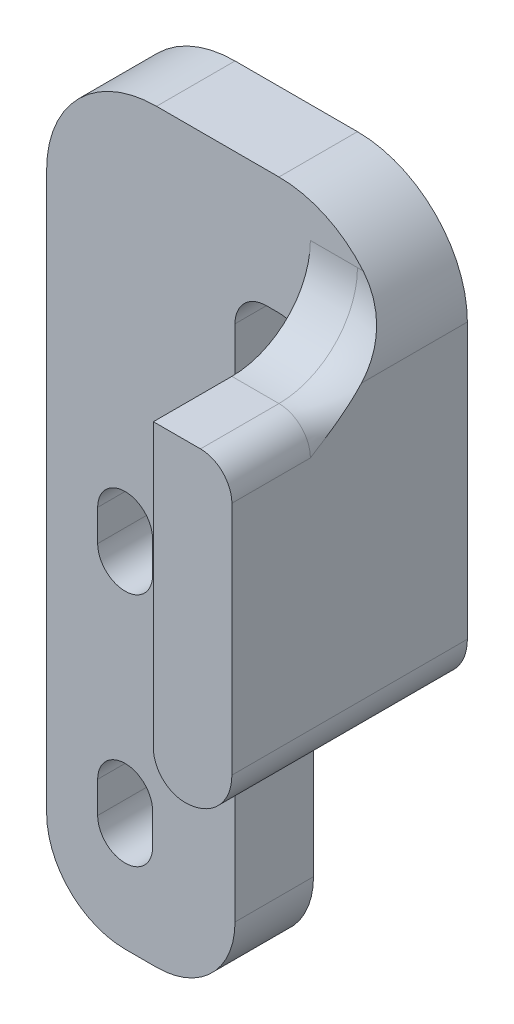
ISO-10303-21;
HEADER;
FILE_DESCRIPTION(('STEP AP214'),'2;1');
FILE_NAME('part.step','',(''),(''),'','','');
FILE_SCHEMA(('AUTOMOTIVE_DESIGN { 1 0 10303 214 1 1 1 1 }'));
ENDSEC;
DATA;
#1=APPLICATION_CONTEXT('core data for automotive mechanical design processes');
#2=APPLICATION_PROTOCOL_DEFINITION('international standard','automotive_design',2000,#1);
#3=PRODUCT_CONTEXT('',#1,'mechanical');
#4=PRODUCT('Part','Part','',(#3));
#5=PRODUCT_RELATED_PRODUCT_CATEGORY('part','',(#4));
#6=PRODUCT_DEFINITION_FORMATION('','',#4);
#7=PRODUCT_DEFINITION_CONTEXT('part definition',#1,'design');
#8=PRODUCT_DEFINITION('design','',#6,#7);
#9=PRODUCT_DEFINITION_SHAPE('','',#8);
#10=(LENGTH_UNIT() NAMED_UNIT(*) SI_UNIT(.MILLI.,.METRE.));
#11=(NAMED_UNIT(*) PLANE_ANGLE_UNIT() SI_UNIT($,.RADIAN.));
#12=(NAMED_UNIT(*) SI_UNIT($,.STERADIAN.) SOLID_ANGLE_UNIT());
#13=UNCERTAINTY_MEASURE_WITH_UNIT(LENGTH_MEASURE(1.E-05),#10,'distance_accuracy_value','');
#14=(GEOMETRIC_REPRESENTATION_CONTEXT(3) GLOBAL_UNCERTAINTY_ASSIGNED_CONTEXT((#13)) GLOBAL_UNIT_ASSIGNED_CONTEXT((#10,
#11,#12)) REPRESENTATION_CONTEXT('',''));
#15=CARTESIAN_POINT('',(0.,0.,0.));
#16=DIRECTION('',(0.,0.,1.));
#17=DIRECTION('',(1.,0.,0.));
#18=AXIS2_PLACEMENT_3D('',#15,#16,#17);
#19=CARTESIAN_POINT('',(0.,0.,5.));
#20=DIRECTION('',(0.,0.,-1.));
#21=DIRECTION('',(-1.,0.,0.));
#22=AXIS2_PLACEMENT_3D('',#19,#20,#21);
#23=PLANE('',#22);
#24=CARTESIAN_POINT('',(-2.,-13.5,5.));
#25=DIRECTION('',(0.,0.,1.));
#26=DIRECTION('',(1.,0.,0.));
#27=AXIS2_PLACEMENT_3D('',#24,#25,#26);
#28=CIRCLE('',#27,1.75);
#29=CARTESIAN_POINT('',(-3.75,-13.5,5.));
#30=VERTEX_POINT('',#29);
#31=CARTESIAN_POINT('',(-0.249999999999996,-13.5,5.));
#32=VERTEX_POINT('',#31);
#33=EDGE_CURVE('E247',#30,#32,#28,.T.);
#34=ORIENTED_EDGE('',*,*,#33,.F.);
#35=DIRECTION('',(0.,-1.,0.));
#36=VECTOR('',#35,1.);
#37=CARTESIAN_POINT('',(-3.75,-13.5,5.));
#38=LINE('',#37,#36);
#39=CARTESIAN_POINT('',(-3.75,-11.5,5.));
#40=VERTEX_POINT('',#39);
#41=EDGE_CURVE('E255',#40,#30,#38,.T.);
#42=ORIENTED_EDGE('',*,*,#41,.F.);
#43=CARTESIAN_POINT('',(-2.,-11.5,5.));
#44=DIRECTION('',(0.,0.,1.));
#45=DIRECTION('',(1.,0.,0.));
#46=AXIS2_PLACEMENT_3D('',#43,#44,#45);
#47=CIRCLE('',#46,1.75);
#48=CARTESIAN_POINT('',(-0.249999999999996,-11.5,5.));
#49=VERTEX_POINT('',#48);
#50=EDGE_CURVE('E252',#49,#40,#47,.T.);
#51=ORIENTED_EDGE('',*,*,#50,.F.);
#52=DIRECTION('',(0.,1.,0.));
#53=VECTOR('',#52,1.);
#54=CARTESIAN_POINT('',(-0.249999999999996,-13.5,5.));
#55=LINE('',#54,#53);
#56=EDGE_CURVE('E249',#32,#49,#55,.T.);
#57=ORIENTED_EDGE('',*,*,#56,.F.);
#58=EDGE_LOOP('',(#34,#42,#51,#57));
#59=FACE_BOUND('',#58,.T.);
#60=CARTESIAN_POINT('',(-2.,1.5,5.));
#61=DIRECTION('',(0.,0.,1.));
#62=DIRECTION('',(1.,0.,0.));
#63=AXIS2_PLACEMENT_3D('',#60,#61,#62);
#64=CIRCLE('',#63,1.75);
#65=CARTESIAN_POINT('',(-3.75,1.5,5.));
#66=VERTEX_POINT('',#65);
#67=CARTESIAN_POINT('',(-0.249999999999999,1.5,5.));
#68=VERTEX_POINT('',#67);
#69=EDGE_CURVE('E278',#66,#68,#64,.T.);
#70=ORIENTED_EDGE('',*,*,#69,.F.);
#71=DIRECTION('',(0.,-1.,0.));
#72=VECTOR('',#71,1.);
#73=CARTESIAN_POINT('',(-3.75,1.5,5.));
#74=LINE('',#73,#72);
#75=CARTESIAN_POINT('',(-3.75,3.5,5.));
#76=VERTEX_POINT('',#75);
#77=EDGE_CURVE('E286',#76,#66,#74,.T.);
#78=ORIENTED_EDGE('',*,*,#77,.F.);
#79=CARTESIAN_POINT('',(-2.,3.5,5.));
#80=DIRECTION('',(0.,0.,1.));
#81=DIRECTION('',(1.,0.,0.));
#82=AXIS2_PLACEMENT_3D('',#79,#80,#81);
#83=CIRCLE('',#82,1.75);
#84=CARTESIAN_POINT('',(-0.249999999999999,3.5,5.));
#85=VERTEX_POINT('',#84);
#86=EDGE_CURVE('E283',#85,#76,#83,.T.);
#87=ORIENTED_EDGE('',*,*,#86,.F.);
#88=DIRECTION('',(0.,1.,0.));
#89=VECTOR('',#88,1.);
#90=CARTESIAN_POINT('',(-0.249999999999999,1.5,5.));
#91=LINE('',#90,#89);
#92=EDGE_CURVE('E280',#68,#85,#91,.T.);
#93=ORIENTED_EDGE('',*,*,#92,.F.);
#94=EDGE_LOOP('',(#70,#78,#87,#93));
#95=FACE_BOUND('',#94,.T.);
#96=DIRECTION('',(-1.,0.,0.));
#97=VECTOR('',#96,1.);
#98=CARTESIAN_POINT('',(12.8,25.,5.));
#99=LINE('',#98,#97);
#100=CARTESIAN_POINT('',(9.8,25.,5.));
#101=VERTEX_POINT('',#100);
#102=CARTESIAN_POINT('',(12.8,25.,5.));
#103=VERTEX_POINT('',#102);
#104=EDGE_CURVE('E415',#101,#103,#99,.F.);
#105=ORIENTED_EDGE('',*,*,#104,.T.);
#106=CARTESIAN_POINT('',(12.8,18.,5.));
#107=DIRECTION('',(0.,0.,-1.));
#108=DIRECTION('',(-1.,0.,0.));
#109=AXIS2_PLACEMENT_3D('',#106,#107,#108);
#110=CIRCLE('',#109,7.);
#111=CARTESIAN_POINT('',(13.1701045277132,24.9902090554265,5.));
#112=VERTEX_POINT('',#111);
#113=EDGE_CURVE('E420',#103,#112,#110,.T.);
#114=ORIENTED_EDGE('',*,*,#113,.T.);
#115=CARTESIAN_POINT('',(7.8,20.5,5.));
#116=DIRECTION('',(0.,0.,-1.));
#117=DIRECTION('',(-1.,0.,0.));
#118=AXIS2_PLACEMENT_3D('',#115,#116,#117);
#119=CIRCLE('',#118,7.);
#120=CARTESIAN_POINT('',(7.8,27.5,5.));
#121=VERTEX_POINT('',#120);
#122=EDGE_CURVE('E366',#112,#121,#119,.F.);
#123=ORIENTED_EDGE('',*,*,#122,.T.);
#124=DIRECTION('',(-1.,0.,0.));
#125=VECTOR('',#124,1.);
#126=CARTESIAN_POINT('',(-7.,27.5,5.));
#127=LINE('',#126,#125);
#128=CARTESIAN_POINT('',(0.,27.5,5.));
#129=VERTEX_POINT('',#128);
#130=EDGE_CURVE('E309',#121,#129,#127,.T.);
#131=ORIENTED_EDGE('',*,*,#130,.T.);
#132=CARTESIAN_POINT('',(0.,20.5,5.));
#133=DIRECTION('',(0.,0.,-1.));
#134=DIRECTION('',(-1.,0.,0.));
#135=AXIS2_PLACEMENT_3D('',#132,#133,#134);
#136=CIRCLE('',#135,7.);
#137=CARTESIAN_POINT('',(-7.,20.5,5.));
#138=VERTEX_POINT('',#137);
#139=EDGE_CURVE('E364',#129,#138,#136,.F.);
#140=ORIENTED_EDGE('',*,*,#139,.T.);
#141=DIRECTION('',(0.,-1.,0.));
#142=VECTOR('',#141,1.);
#143=CARTESIAN_POINT('',(-7.,-20.,5.));
#144=LINE('',#143,#142);
#145=CARTESIAN_POINT('',(-7.,-15.,5.));
#146=VERTEX_POINT('',#145);
#147=EDGE_CURVE('E312',#138,#146,#144,.T.);
#148=ORIENTED_EDGE('',*,*,#147,.T.);
#149=CARTESIAN_POINT('',(-2.,-15.,5.));
#150=DIRECTION('',(0.,0.,-1.));
#151=DIRECTION('',(-1.,0.,0.));
#152=AXIS2_PLACEMENT_3D('',#149,#150,#151);
#153=CIRCLE('',#152,5.);
#154=CARTESIAN_POINT('',(-2.,-20.,5.));
#155=VERTEX_POINT('',#154);
#156=EDGE_CURVE('E370',#146,#155,#153,.F.);
#157=ORIENTED_EDGE('',*,*,#156,.T.);
#158=DIRECTION('',(1.,0.,0.));
#159=VECTOR('',#158,1.);
#160=CARTESIAN_POINT('',(-7.,-20.,5.));
#161=LINE('',#160,#159);
#162=CARTESIAN_POINT('',(0.,-20.,5.));
#163=VERTEX_POINT('',#162);
#164=EDGE_CURVE('E316',#155,#163,#161,.T.);
#165=ORIENTED_EDGE('',*,*,#164,.T.);
#166=CARTESIAN_POINT('',(0.,-15.,5.));
#167=DIRECTION('',(0.,0.,-1.));
#168=DIRECTION('',(-1.,0.,0.));
#169=AXIS2_PLACEMENT_3D('',#166,#167,#168);
#170=CIRCLE('',#169,5.);
#171=CARTESIAN_POINT('',(5.,-15.,5.));
#172=VERTEX_POINT('',#171);
#173=EDGE_CURVE('E368',#163,#172,#170,.F.);
#174=ORIENTED_EDGE('',*,*,#173,.T.);
#175=DIRECTION('',(0.,1.,0.));
#176=VECTOR('',#175,1.);
#177=CARTESIAN_POINT('',(5.,-20.,5.));
#178=LINE('',#177,#176);
#179=CARTESIAN_POINT('',(5.,18.,5.));
#180=VERTEX_POINT('',#179);
#181=EDGE_CURVE('E319',#172,#180,#178,.T.);
#182=ORIENTED_EDGE('',*,*,#181,.T.);
#183=CARTESIAN_POINT('',(7.,18.,5.));
#184=DIRECTION('',(0.,0.,-1.));
#185=DIRECTION('',(-1.,0.,0.));
#186=AXIS2_PLACEMENT_3D('',#183,#184,#185);
#187=CIRCLE('',#186,2.);
#188=CARTESIAN_POINT('',(7.,20.,5.));
#189=VERTEX_POINT('',#188);
#190=EDGE_CURVE('E413',#180,#189,#187,.T.);
#191=ORIENTED_EDGE('',*,*,#190,.T.);
#192=DIRECTION('',(1.,0.,0.));
#193=VECTOR('',#192,1.);
#194=CARTESIAN_POINT('',(9.8,20.,5.));
#195=LINE('',#194,#193);
#196=CARTESIAN_POINT('',(7.8,20.,5.));
#197=VERTEX_POINT('',#196);
#198=EDGE_CURVE('E322',#189,#197,#195,.T.);
#199=ORIENTED_EDGE('',*,*,#198,.T.);
#200=CARTESIAN_POINT('',(7.8,18.,5.));
#201=DIRECTION('',(0.,0.,-1.));
#202=DIRECTION('',(-1.,0.,0.));
#203=AXIS2_PLACEMENT_3D('',#200,#201,#202);
#204=CIRCLE('',#203,2.);
#205=CARTESIAN_POINT('',(9.8,18.,5.));
#206=VERTEX_POINT('',#205);
#207=EDGE_CURVE('E409',#197,#206,#204,.T.);
#208=ORIENTED_EDGE('',*,*,#207,.T.);
#209=DIRECTION('',(0.,-1.,0.));
#210=VECTOR('',#209,1.);
#211=CARTESIAN_POINT('',(9.8,0.,5.));
#212=LINE('',#211,#210);
#213=EDGE_CURVE('E390',#101,#206,#212,.T.);
#214=ORIENTED_EDGE('',*,*,#213,.F.);
#215=EDGE_LOOP('',(#105,#114,#123,#131,#140,#148,#157,#165,#174,#182,#191,#199,#208,#214));
#216=FACE_BOUND('',#215,.T.);
#217=ADVANCED_FACE('F37',(#59,#95,#216),#23,.F.);
#218=CARTESIAN_POINT('',(0.,0.,0.));
#219=DIRECTION('',(0.,0.,-1.));
#220=DIRECTION('',(-1.,0.,0.));
#221=AXIS2_PLACEMENT_3D('',#218,#219,#220);
#222=PLANE('',#221);
#223=DIRECTION('',(1.,0.,0.));
#224=VECTOR('',#223,1.);
#225=CARTESIAN_POINT('',(-7.,-20.,0.));
#226=LINE('',#225,#224);
#227=CARTESIAN_POINT('',(-2.,-20.,0.));
#228=VERTEX_POINT('',#227);
#229=CARTESIAN_POINT('',(0.,-20.,0.));
#230=VERTEX_POINT('',#229);
#231=EDGE_CURVE('E328',#228,#230,#226,.T.);
#232=ORIENTED_EDGE('',*,*,#231,.F.);
#233=CARTESIAN_POINT('',(-2.,-15.,0.));
#234=DIRECTION('',(0.,0.,-1.));
#235=DIRECTION('',(-1.,0.,0.));
#236=AXIS2_PLACEMENT_3D('',#233,#234,#235);
#237=CIRCLE('',#236,5.);
#238=CARTESIAN_POINT('',(-7.,-15.,0.));
#239=VERTEX_POINT('',#238);
#240=EDGE_CURVE('E357',#228,#239,#237,.T.);
#241=ORIENTED_EDGE('',*,*,#240,.T.);
#242=DIRECTION('',(0.,-1.,0.));
#243=VECTOR('',#242,1.);
#244=CARTESIAN_POINT('',(-7.,-20.,0.));
#245=LINE('',#244,#243);
#246=CARTESIAN_POINT('',(-7.,20.5,0.));
#247=VERTEX_POINT('',#246);
#248=EDGE_CURVE('E308',#247,#239,#245,.T.);
#249=ORIENTED_EDGE('',*,*,#248,.F.);
#250=CARTESIAN_POINT('',(0.,20.5,0.));
#251=DIRECTION('',(0.,0.,-1.));
#252=DIRECTION('',(-1.,0.,0.));
#253=AXIS2_PLACEMENT_3D('',#250,#251,#252);
#254=CIRCLE('',#253,7.);
#255=CARTESIAN_POINT('',(0.,27.5,0.));
#256=VERTEX_POINT('',#255);
#257=EDGE_CURVE('E347',#247,#256,#254,.T.);
#258=ORIENTED_EDGE('',*,*,#257,.T.);
#259=DIRECTION('',(-1.,0.,0.));
#260=VECTOR('',#259,1.);
#261=CARTESIAN_POINT('',(3.,27.5,0.));
#262=LINE('',#261,#260);
#263=CARTESIAN_POINT('',(7.8,27.5,0.));
#264=VERTEX_POINT('',#263);
#265=EDGE_CURVE('E313',#264,#256,#262,.T.);
#266=ORIENTED_EDGE('',*,*,#265,.F.);
#267=CARTESIAN_POINT('',(7.8,20.5,0.));
#268=DIRECTION('',(0.,0.,-1.));
#269=DIRECTION('',(-1.,0.,0.));
#270=AXIS2_PLACEMENT_3D('',#267,#268,#269);
#271=CIRCLE('',#270,7.);
#272=CARTESIAN_POINT('',(14.8,20.5,0.));
#273=VERTEX_POINT('',#272);
#274=EDGE_CURVE('E349',#264,#273,#271,.T.);
#275=ORIENTED_EDGE('',*,*,#274,.T.);
#276=DIRECTION('',(0.,1.,0.));
#277=VECTOR('',#276,1.);
#278=CARTESIAN_POINT('',(14.8,27.5,0.));
#279=LINE('',#278,#277);
#280=CARTESIAN_POINT('',(14.8,3.,0.));
#281=VERTEX_POINT('',#280);
#282=EDGE_CURVE('E339',#281,#273,#279,.T.);
#283=ORIENTED_EDGE('',*,*,#282,.F.);
#284=CARTESIAN_POINT('',(11.8,3.,0.));
#285=DIRECTION('',(0.,0.,-1.));
#286=DIRECTION('',(-1.,0.,0.));
#287=AXIS2_PLACEMENT_3D('',#284,#285,#286);
#288=CIRCLE('',#287,3.);
#289=CARTESIAN_POINT('',(11.8,0.,0.));
#290=VERTEX_POINT('',#289);
#291=EDGE_CURVE('E353',#281,#290,#288,.T.);
#292=ORIENTED_EDGE('',*,*,#291,.T.);
#293=CARTESIAN_POINT('',(11.8,2.,0.));
#294=DIRECTION('',(0.,0.,-1.));
#295=DIRECTION('',(-1.,0.,0.));
#296=AXIS2_PLACEMENT_3D('',#293,#294,#295);
#297=CIRCLE('',#296,2.);
#298=CARTESIAN_POINT('',(9.8,2.,0.));
#299=VERTEX_POINT('',#298);
#300=EDGE_CURVE('E351',#290,#299,#297,.T.);
#301=ORIENTED_EDGE('',*,*,#300,.T.);
#302=DIRECTION('',(0.,-1.,0.));
#303=VECTOR('',#302,1.);
#304=CARTESIAN_POINT('',(9.8,0.,0.));
#305=LINE('',#304,#303);
#306=CARTESIAN_POINT('',(9.8,18.,0.));
#307=VERTEX_POINT('',#306);
#308=EDGE_CURVE('E337',#307,#299,#305,.T.);
#309=ORIENTED_EDGE('',*,*,#308,.F.);
#310=CARTESIAN_POINT('',(7.8,18.,0.));
#311=DIRECTION('',(0.,0.,-1.));
#312=DIRECTION('',(-1.,0.,0.));
#313=AXIS2_PLACEMENT_3D('',#310,#311,#312);
#314=CIRCLE('',#313,2.);
#315=CARTESIAN_POINT('',(7.8,20.,0.));
#316=VERTEX_POINT('',#315);
#317=EDGE_CURVE('E407',#307,#316,#314,.F.);
#318=ORIENTED_EDGE('',*,*,#317,.T.);
#319=DIRECTION('',(1.,0.,0.));
#320=VECTOR('',#319,1.);
#321=CARTESIAN_POINT('',(9.8,20.,0.));
#322=LINE('',#321,#320);
#323=CARTESIAN_POINT('',(7.,20.,0.));
#324=VERTEX_POINT('',#323);
#325=EDGE_CURVE('E334',#324,#316,#322,.T.);
#326=ORIENTED_EDGE('',*,*,#325,.F.);
#327=CARTESIAN_POINT('',(7.,18.,0.));
#328=DIRECTION('',(0.,0.,-1.));
#329=DIRECTION('',(-1.,0.,0.));
#330=AXIS2_PLACEMENT_3D('',#327,#328,#329);
#331=CIRCLE('',#330,2.);
#332=CARTESIAN_POINT('',(5.,18.,0.));
#333=VERTEX_POINT('',#332);
#334=EDGE_CURVE('E411',#324,#333,#331,.F.);
#335=ORIENTED_EDGE('',*,*,#334,.T.);
#336=DIRECTION('',(0.,1.,0.));
#337=VECTOR('',#336,1.);
#338=CARTESIAN_POINT('',(5.,-20.,0.));
#339=LINE('',#338,#337);
#340=CARTESIAN_POINT('',(5.,-15.,0.));
#341=VERTEX_POINT('',#340);
#342=EDGE_CURVE('E331',#341,#333,#339,.T.);
#343=ORIENTED_EDGE('',*,*,#342,.F.);
#344=CARTESIAN_POINT('',(0.,-15.,0.));
#345=DIRECTION('',(0.,0.,-1.));
#346=DIRECTION('',(-1.,0.,0.));
#347=AXIS2_PLACEMENT_3D('',#344,#345,#346);
#348=CIRCLE('',#347,5.);
#349=EDGE_CURVE('E355',#341,#230,#348,.T.);
#350=ORIENTED_EDGE('',*,*,#349,.T.);
#351=EDGE_LOOP('',(#232,#241,#249,#258,#266,#275,#283,#292,#301,#309,#318,#326,#335,#343,#350));
#352=FACE_BOUND('',#351,.T.);
#353=DIRECTION('',(0.,-1.,0.));
#354=VECTOR('',#353,1.);
#355=CARTESIAN_POINT('',(-3.75,1.5,0.));
#356=LINE('',#355,#354);
#357=CARTESIAN_POINT('',(-3.75,3.5,0.));
#358=VERTEX_POINT('',#357);
#359=CARTESIAN_POINT('',(-3.75,1.5,0.));
#360=VERTEX_POINT('',#359);
#361=EDGE_CURVE('E281',#358,#360,#356,.T.);
#362=ORIENTED_EDGE('',*,*,#361,.T.);
#363=CARTESIAN_POINT('',(-2.,1.5,0.));
#364=DIRECTION('',(0.,0.,1.));
#365=DIRECTION('',(1.,0.,0.));
#366=AXIS2_PLACEMENT_3D('',#363,#364,#365);
#367=CIRCLE('',#366,1.75);
#368=CARTESIAN_POINT('',(-0.249999999999999,1.5,0.));
#369=VERTEX_POINT('',#368);
#370=EDGE_CURVE('E277',#360,#369,#367,.T.);
#371=ORIENTED_EDGE('',*,*,#370,.T.);
#372=DIRECTION('',(0.,1.,0.));
#373=VECTOR('',#372,1.);
#374=CARTESIAN_POINT('',(-0.249999999999999,1.5,0.));
#375=LINE('',#374,#373);
#376=CARTESIAN_POINT('',(-0.249999999999999,3.5,0.));
#377=VERTEX_POINT('',#376);
#378=EDGE_CURVE('E291',#369,#377,#375,.T.);
#379=ORIENTED_EDGE('',*,*,#378,.T.);
#380=CARTESIAN_POINT('',(-2.,3.5,0.));
#381=DIRECTION('',(0.,0.,1.));
#382=DIRECTION('',(1.,0.,0.));
#383=AXIS2_PLACEMENT_3D('',#380,#381,#382);
#384=CIRCLE('',#383,1.75);
#385=EDGE_CURVE('E294',#377,#358,#384,.T.);
#386=ORIENTED_EDGE('',*,*,#385,.T.);
#387=EDGE_LOOP('',(#362,#371,#379,#386));
#388=FACE_BOUND('',#387,.T.);
#389=DIRECTION('',(0.,-1.,0.));
#390=VECTOR('',#389,1.);
#391=CARTESIAN_POINT('',(-3.75,-13.5,0.));
#392=LINE('',#391,#390);
#393=CARTESIAN_POINT('',(-3.75,-11.5,0.));
#394=VERTEX_POINT('',#393);
#395=CARTESIAN_POINT('',(-3.75,-13.5,0.));
#396=VERTEX_POINT('',#395);
#397=EDGE_CURVE('E250',#394,#396,#392,.T.);
#398=ORIENTED_EDGE('',*,*,#397,.T.);
#399=CARTESIAN_POINT('',(-2.,-13.5,0.));
#400=DIRECTION('',(0.,0.,1.));
#401=DIRECTION('',(1.,0.,0.));
#402=AXIS2_PLACEMENT_3D('',#399,#400,#401);
#403=CIRCLE('',#402,1.75);
#404=CARTESIAN_POINT('',(-0.249999999999996,-13.5,0.));
#405=VERTEX_POINT('',#404);
#406=EDGE_CURVE('E238',#396,#405,#403,.T.);
#407=ORIENTED_EDGE('',*,*,#406,.T.);
#408=DIRECTION('',(0.,1.,0.));
#409=VECTOR('',#408,1.);
#410=CARTESIAN_POINT('',(-0.249999999999996,-13.5,0.));
#411=LINE('',#410,#409);
#412=CARTESIAN_POINT('',(-0.249999999999996,-11.5,0.));
#413=VERTEX_POINT('',#412);
#414=EDGE_CURVE('E260',#405,#413,#411,.T.);
#415=ORIENTED_EDGE('',*,*,#414,.T.);
#416=CARTESIAN_POINT('',(-2.,-11.5,0.));
#417=DIRECTION('',(0.,0.,1.));
#418=DIRECTION('',(1.,0.,0.));
#419=AXIS2_PLACEMENT_3D('',#416,#417,#418);
#420=CIRCLE('',#419,1.75);
#421=EDGE_CURVE('E263',#413,#394,#420,.T.);
#422=ORIENTED_EDGE('',*,*,#421,.T.);
#423=EDGE_LOOP('',(#398,#407,#415,#422));
#424=FACE_BOUND('',#423,.T.);
#425=ADVANCED_FACE('F457',(#352,#388,#424),#222,.T.);
#426=CARTESIAN_POINT('',(-7.,-20.,5.));
#427=DIRECTION('',(1.,0.,0.));
#428=DIRECTION('',(0.,0.,-1.));
#429=AXIS2_PLACEMENT_3D('',#426,#427,#428);
#430=PLANE('',#429);
#431=ORIENTED_EDGE('',*,*,#248,.T.);
#432=DIRECTION('',(0.,0.,-1.));
#433=VECTOR('',#432,1.);
#434=CARTESIAN_POINT('',(-7.,-15.,5.));
#435=LINE('',#434,#433);
#436=EDGE_CURVE('E362',#239,#146,#435,.F.);
#437=ORIENTED_EDGE('',*,*,#436,.T.);
#438=ORIENTED_EDGE('',*,*,#147,.F.);
#439=DIRECTION('',(0.,0.,-1.));
#440=VECTOR('',#439,1.);
#441=CARTESIAN_POINT('',(-7.,20.5,5.));
#442=LINE('',#441,#440);
#443=EDGE_CURVE('E359',#138,#247,#442,.T.);
#444=ORIENTED_EDGE('',*,*,#443,.T.);
#445=EDGE_LOOP('',(#431,#437,#438,#444));
#446=FACE_BOUND('',#445,.T.);
#447=ADVANCED_FACE('F463',(#446),#430,.F.);
#448=CARTESIAN_POINT('',(-7.,-20.,5.));
#449=DIRECTION('',(0.,1.,0.));
#450=DIRECTION('',(0.,0.,1.));
#451=AXIS2_PLACEMENT_3D('',#448,#449,#450);
#452=PLANE('',#451);
#453=ORIENTED_EDGE('',*,*,#164,.F.);
#454=DIRECTION('',(0.,0.,-1.));
#455=VECTOR('',#454,1.);
#456=CARTESIAN_POINT('',(-2.,-20.,5.));
#457=LINE('',#456,#455);
#458=EDGE_CURVE('E344',#155,#228,#457,.T.);
#459=ORIENTED_EDGE('',*,*,#458,.T.);
#460=ORIENTED_EDGE('',*,*,#231,.T.);
#461=DIRECTION('',(0.,0.,-1.));
#462=VECTOR('',#461,1.);
#463=CARTESIAN_POINT('',(0.,-20.,5.));
#464=LINE('',#463,#462);
#465=EDGE_CURVE('E325',#230,#163,#464,.F.);
#466=ORIENTED_EDGE('',*,*,#465,.T.);
#467=EDGE_LOOP('',(#453,#459,#460,#466));
#468=FACE_BOUND('',#467,.T.);
#469=ADVANCED_FACE('F488',(#468),#452,.F.);
#470=CARTESIAN_POINT('',(5.,-20.,5.));
#471=DIRECTION('',(-1.,0.,0.));
#472=DIRECTION('',(0.,0.,1.));
#473=AXIS2_PLACEMENT_3D('',#470,#471,#472);
#474=PLANE('',#473);
#475=ORIENTED_EDGE('',*,*,#181,.F.);
#476=DIRECTION('',(0.,0.,-1.));
#477=VECTOR('',#476,1.);
#478=CARTESIAN_POINT('',(5.,-15.,5.));
#479=LINE('',#478,#477);
#480=EDGE_CURVE('E374',#172,#341,#479,.T.);
#481=ORIENTED_EDGE('',*,*,#480,.T.);
#482=ORIENTED_EDGE('',*,*,#342,.T.);
#483=DIRECTION('',(0.,0.,-1.));
#484=VECTOR('',#483,1.);
#485=CARTESIAN_POINT('',(5.,18.,5.));
#486=LINE('',#485,#484);
#487=EDGE_CURVE('E372',#333,#180,#486,.F.);
#488=ORIENTED_EDGE('',*,*,#487,.T.);
#489=EDGE_LOOP('',(#475,#481,#482,#488));
#490=FACE_BOUND('',#489,.T.);
#491=ADVANCED_FACE('F484',(#490),#474,.F.);
#492=CARTESIAN_POINT('',(9.8,20.,5.));
#493=DIRECTION('',(0.,1.,0.));
#494=DIRECTION('',(0.,0.,1.));
#495=AXIS2_PLACEMENT_3D('',#492,#493,#494);
#496=PLANE('',#495);
#497=ORIENTED_EDGE('',*,*,#325,.T.);
#498=DIRECTION('',(0.,0.,-1.));
#499=VECTOR('',#498,1.);
#500=CARTESIAN_POINT('',(7.8,20.,5.));
#501=LINE('',#500,#499);
#502=EDGE_CURVE('E400',#316,#197,#501,.F.);
#503=ORIENTED_EDGE('',*,*,#502,.T.);
#504=ORIENTED_EDGE('',*,*,#198,.F.);
#505=DIRECTION('',(0.,0.,-1.));
#506=VECTOR('',#505,1.);
#507=CARTESIAN_POINT('',(7.,20.,0.));
#508=LINE('',#507,#506);
#509=EDGE_CURVE('E397',#189,#324,#508,.T.);
#510=ORIENTED_EDGE('',*,*,#509,.T.);
#511=EDGE_LOOP('',(#497,#503,#504,#510));
#512=FACE_BOUND('',#511,.T.);
#513=ADVANCED_FACE('F481',(#512),#496,.F.);
#514=CARTESIAN_POINT('',(9.8,0.,5.));
#515=DIRECTION('',(1.,0.,0.));
#516=DIRECTION('',(0.,0.,-1.));
#517=AXIS2_PLACEMENT_3D('',#514,#515,#516);
#518=PLANE('',#517);
#519=ORIENTED_EDGE('',*,*,#308,.T.);
#520=DIRECTION('',(0.,0.,-1.));
#521=VECTOR('',#520,1.);
#522=CARTESIAN_POINT('',(9.8,2.,5.));
#523=LINE('',#522,#521);
#524=CARTESIAN_POINT('',(9.8,2.,15.));
#525=VERTEX_POINT('',#524);
#526=EDGE_CURVE('E243',#299,#525,#523,.F.);
#527=ORIENTED_EDGE('',*,*,#526,.T.);
#528=DIRECTION('',(0.,-1.,0.));
#529=VECTOR('',#528,1.);
#530=CARTESIAN_POINT('',(9.8,0.,15.));
#531=LINE('',#530,#529);
#532=CARTESIAN_POINT('',(9.8,20.,15.));
#533=VERTEX_POINT('',#532);
#534=EDGE_CURVE('E227',#533,#525,#531,.T.);
#535=ORIENTED_EDGE('',*,*,#534,.F.);
#536=DIRECTION('',(0.,0.,-1.));
#537=VECTOR('',#536,1.);
#538=CARTESIAN_POINT('',(9.8,20.,15.));
#539=LINE('',#538,#537);
#540=CARTESIAN_POINT('',(9.8,20.,10.));
#541=VERTEX_POINT('',#540);
#542=EDGE_CURVE('E234',#533,#541,#539,.T.);
#543=ORIENTED_EDGE('',*,*,#542,.T.);
#544=CARTESIAN_POINT('',(9.8,25.,10.));
#545=DIRECTION('',(1.,0.,0.));
#546=DIRECTION('',(0.,0.,-1.));
#547=AXIS2_PLACEMENT_3D('',#544,#545,#546);
#548=CIRCLE('',#547,5.);
#549=EDGE_CURVE('E12',#541,#101,#548,.T.);
#550=ORIENTED_EDGE('',*,*,#549,.T.);
#551=ORIENTED_EDGE('',*,*,#213,.T.);
#552=DIRECTION('',(0.,0.,-1.));
#553=VECTOR('',#552,1.);
#554=CARTESIAN_POINT('',(9.8,18.,0.));
#555=LINE('',#554,#553);
#556=EDGE_CURVE('E393',#206,#307,#555,.T.);
#557=ORIENTED_EDGE('',*,*,#556,.T.);
#558=EDGE_LOOP('',(#519,#527,#535,#543,#550,#551,#557));
#559=FACE_BOUND('',#558,.T.);
#560=ADVANCED_FACE('F241',(#559),#518,.F.);
#561=CARTESIAN_POINT('',(14.8,27.5,5.));
#562=DIRECTION('',(-1.,0.,0.));
#563=DIRECTION('',(0.,-1.,0.));
#564=AXIS2_PLACEMENT_3D('',#561,#562,#563);
#565=PLANE('',#564);
#566=DIRECTION('',(0.,1.,0.));
#567=VECTOR('',#566,1.);
#568=CARTESIAN_POINT('',(14.8,0.,15.));
#569=LINE('',#568,#567);
#570=CARTESIAN_POINT('',(14.8,3.,15.));
#571=VERTEX_POINT('',#570);
#572=CARTESIAN_POINT('',(14.8,18.,15.));
#573=VERTEX_POINT('',#572);
#574=EDGE_CURVE('E232',#571,#573,#569,.T.);
#575=ORIENTED_EDGE('',*,*,#574,.F.);
#576=DIRECTION('',(0.,0.,-1.));
#577=VECTOR('',#576,1.);
#578=CARTESIAN_POINT('',(14.8,3.,5.));
#579=LINE('',#578,#577);
#580=EDGE_CURVE('E380',#571,#281,#579,.T.);
#581=ORIENTED_EDGE('',*,*,#580,.T.);
#582=ORIENTED_EDGE('',*,*,#282,.T.);
#583=DIRECTION('',(0.,0.,-1.));
#584=VECTOR('',#583,1.);
#585=CARTESIAN_POINT('',(14.8,20.5,5.));
#586=LINE('',#585,#584);
#587=CARTESIAN_POINT('',(14.8,20.5,6.74855883306649));
#588=VERTEX_POINT('',#587);
#589=EDGE_CURVE('E53',#273,#588,#586,.F.);
#590=ORIENTED_EDGE('',*,*,#589,.T.);
#591=CARTESIAN_POINT('',(14.8,20.5,6.74855883306649));
#592=CARTESIAN_POINT('',(14.8,20.3928925493411,6.84625097283995));
#593=CARTESIAN_POINT('',(14.8,20.2884054455574,6.94676192864299));
#594=CARTESIAN_POINT('',(14.8,20.0844733860793,7.15266336389118));
#595=CARTESIAN_POINT('',(14.8,19.9850254514301,7.25805088830399));
#596=CARTESIAN_POINT('',(14.8,19.7912103910387,7.47266203585071));
#597=CARTESIAN_POINT('',(14.8,19.6968255819175,7.58186976082162));
#598=CARTESIAN_POINT('',(14.8,19.5123282187455,7.80385157026491));
#599=CARTESIAN_POINT('',(14.8,19.4222163178864,7.91662619563838));
#600=CARTESIAN_POINT('',(14.8,19.1586599117451,8.25797226681118));
#601=CARTESIAN_POINT('',(14.8,18.9908354147775,8.49087751138395));
#602=CARTESIAN_POINT('',(14.8,18.665419447407,8.96386714301632));
#603=CARTESIAN_POINT('',(14.8,18.5078369320252,9.20395755152535));
#604=CARTESIAN_POINT('',(14.8,18.2366992954369,9.62581016257153));
#605=CARTESIAN_POINT('',(14.8,18.1221153602673,9.80692005322796));
#606=CARTESIAN_POINT('',(14.8,18.0050395263084,9.99203180920772));
#607=CARTESIAN_POINT('',(14.8,18.002519763146,9.99601590457322));
#608=CARTESIAN_POINT('',(14.8,18.,10.));
#609=B_SPLINE_CURVE_WITH_KNOTS('',3,(#591,#592,#593,#594,#595,#596,#597,#598,#599,#600,#601,
#602,#603,#604,#605,#606,#607,#608),.UNSPECIFIED.,.F.,.F.,(4,2,2,2,2,2,2,2,4),(0.,
0.434800582518763,0.869341055664193,1.30224911142041,1.73522313309493,2.59593174314666,
3.45738305710849,4.10032389026046,4.1144660258842),.UNSPECIFIED.);
#610=CARTESIAN_POINT('',(14.8,18.,10.));
#611=VERTEX_POINT('',#610);
#612=EDGE_CURVE('E46',#588,#611,#609,.T.);
#613=ORIENTED_EDGE('',*,*,#612,.T.);
#614=DIRECTION('',(0.,0.,-1.));
#615=VECTOR('',#614,1.);
#616=CARTESIAN_POINT('',(14.8,18.,5.));
#617=LINE('',#616,#615);
#618=EDGE_CURVE('E378',#611,#573,#617,.F.);
#619=ORIENTED_EDGE('',*,*,#618,.T.);
#620=EDGE_LOOP('',(#575,#581,#582,#590,#613,#619));
#621=FACE_BOUND('',#620,.T.);
#622=ADVANCED_FACE('F474',(#621),#565,.F.);
#623=CARTESIAN_POINT('',(3.,27.5,5.));
#624=DIRECTION('',(0.,-1.,0.));
#625=DIRECTION('',(0.,0.,-1.));
#626=AXIS2_PLACEMENT_3D('',#623,#624,#625);
#627=PLANE('',#626);
#628=ORIENTED_EDGE('',*,*,#130,.F.);
#629=DIRECTION('',(0.,0.,-1.));
#630=VECTOR('',#629,1.);
#631=CARTESIAN_POINT('',(7.8,27.5,5.));
#632=LINE('',#631,#630);
#633=EDGE_CURVE('E404',#121,#264,#632,.T.);
#634=ORIENTED_EDGE('',*,*,#633,.T.);
#635=ORIENTED_EDGE('',*,*,#265,.T.);
#636=DIRECTION('',(0.,0.,-1.));
#637=VECTOR('',#636,1.);
#638=CARTESIAN_POINT('',(0.,27.5,5.));
#639=LINE('',#638,#637);
#640=EDGE_CURVE('E402',#256,#129,#639,.F.);
#641=ORIENTED_EDGE('',*,*,#640,.T.);
#642=EDGE_LOOP('',(#628,#634,#635,#641));
#643=FACE_BOUND('',#642,.T.);
#644=ADVANCED_FACE('F472',(#643),#627,.F.);
#645=CARTESIAN_POINT('',(-2.,1.5,5.));
#646=DIRECTION('',(0.,0.,-1.));
#647=DIRECTION('',(-1.,0.,0.));
#648=AXIS2_PLACEMENT_3D('',#645,#646,#647);
#649=CYLINDRICAL_SURFACE('',#648,1.75);
#650=ORIENTED_EDGE('',*,*,#370,.F.);
#651=DIRECTION('',(0.,0.,-1.));
#652=VECTOR('',#651,1.);
#653=CARTESIAN_POINT('',(-3.75,1.5,5.));
#654=LINE('',#653,#652);
#655=EDGE_CURVE('E288',#66,#360,#654,.T.);
#656=ORIENTED_EDGE('',*,*,#655,.F.);
#657=ORIENTED_EDGE('',*,*,#69,.T.);
#658=DIRECTION('',(0.,0.,-1.));
#659=VECTOR('',#658,1.);
#660=CARTESIAN_POINT('',(-0.249999999999999,1.5,5.));
#661=LINE('',#660,#659);
#662=EDGE_CURVE('E305',#68,#369,#661,.T.);
#663=ORIENTED_EDGE('',*,*,#662,.T.);
#664=EDGE_LOOP('',(#650,#656,#657,#663));
#665=FACE_BOUND('',#664,.T.);
#666=ADVANCED_FACE('F469',(#665),#649,.F.);
#667=CARTESIAN_POINT('',(-0.249999999999999,1.5,5.));
#668=DIRECTION('',(-1.,0.,0.));
#669=DIRECTION('',(0.,-1.,0.));
#670=AXIS2_PLACEMENT_3D('',#667,#668,#669);
#671=PLANE('',#670);
#672=ORIENTED_EDGE('',*,*,#378,.F.);
#673=ORIENTED_EDGE('',*,*,#662,.F.);
#674=ORIENTED_EDGE('',*,*,#92,.T.);
#675=DIRECTION('',(0.,0.,-1.));
#676=VECTOR('',#675,1.);
#677=CARTESIAN_POINT('',(-0.249999999999999,3.5,5.));
#678=LINE('',#677,#676);
#679=EDGE_CURVE('E303',#85,#377,#678,.T.);
#680=ORIENTED_EDGE('',*,*,#679,.T.);
#681=EDGE_LOOP('',(#672,#673,#674,#680));
#682=FACE_BOUND('',#681,.T.);
#683=ADVANCED_FACE('F755',(#682),#671,.T.);
#684=CARTESIAN_POINT('',(-2.,3.5,5.));
#685=DIRECTION('',(0.,0.,-1.));
#686=DIRECTION('',(-1.,0.,0.));
#687=AXIS2_PLACEMENT_3D('',#684,#685,#686);
#688=CYLINDRICAL_SURFACE('',#687,1.75);
#689=ORIENTED_EDGE('',*,*,#385,.F.);
#690=ORIENTED_EDGE('',*,*,#679,.F.);
#691=ORIENTED_EDGE('',*,*,#86,.T.);
#692=DIRECTION('',(0.,0.,-1.));
#693=VECTOR('',#692,1.);
#694=CARTESIAN_POINT('',(-3.75,3.5,5.));
#695=LINE('',#694,#693);
#696=EDGE_CURVE('E301',#76,#358,#695,.T.);
#697=ORIENTED_EDGE('',*,*,#696,.T.);
#698=EDGE_LOOP('',(#689,#690,#691,#697));
#699=FACE_BOUND('',#698,.T.);
#700=ADVANCED_FACE('F745',(#699),#688,.F.);
#701=CARTESIAN_POINT('',(-3.75,1.5,5.));
#702=DIRECTION('',(1.,0.,0.));
#703=DIRECTION('',(0.,1.,0.));
#704=AXIS2_PLACEMENT_3D('',#701,#702,#703);
#705=PLANE('',#704);
#706=ORIENTED_EDGE('',*,*,#361,.F.);
#707=ORIENTED_EDGE('',*,*,#696,.F.);
#708=ORIENTED_EDGE('',*,*,#77,.T.);
#709=ORIENTED_EDGE('',*,*,#655,.T.);
#710=EDGE_LOOP('',(#706,#707,#708,#709));
#711=FACE_BOUND('',#710,.T.);
#712=ADVANCED_FACE('F735',(#711),#705,.T.);
#713=CARTESIAN_POINT('',(-2.,-13.5,5.));
#714=DIRECTION('',(0.,0.,-1.));
#715=DIRECTION('',(-1.,0.,0.));
#716=AXIS2_PLACEMENT_3D('',#713,#714,#715);
#717=CYLINDRICAL_SURFACE('',#716,1.75);
#718=ORIENTED_EDGE('',*,*,#406,.F.);
#719=DIRECTION('',(0.,0.,-1.));
#720=VECTOR('',#719,1.);
#721=CARTESIAN_POINT('',(-3.75,-13.5,5.));
#722=LINE('',#721,#720);
#723=EDGE_CURVE('E257',#30,#396,#722,.T.);
#724=ORIENTED_EDGE('',*,*,#723,.F.);
#725=ORIENTED_EDGE('',*,*,#33,.T.);
#726=DIRECTION('',(0.,0.,-1.));
#727=VECTOR('',#726,1.);
#728=CARTESIAN_POINT('',(-0.249999999999996,-13.5,5.));
#729=LINE('',#728,#727);
#730=EDGE_CURVE('E274',#32,#405,#729,.T.);
#731=ORIENTED_EDGE('',*,*,#730,.T.);
#732=EDGE_LOOP('',(#718,#724,#725,#731));
#733=FACE_BOUND('',#732,.T.);
#734=ADVANCED_FACE('F725',(#733),#717,.F.);
#735=CARTESIAN_POINT('',(-0.249999999999996,-13.5,5.));
#736=DIRECTION('',(-1.,0.,0.));
#737=DIRECTION('',(0.,-1.,0.));
#738=AXIS2_PLACEMENT_3D('',#735,#736,#737);
#739=PLANE('',#738);
#740=ORIENTED_EDGE('',*,*,#414,.F.);
#741=ORIENTED_EDGE('',*,*,#730,.F.);
#742=ORIENTED_EDGE('',*,*,#56,.T.);
#743=DIRECTION('',(0.,0.,-1.));
#744=VECTOR('',#743,1.);
#745=CARTESIAN_POINT('',(-0.249999999999996,-11.5,5.));
#746=LINE('',#745,#744);
#747=EDGE_CURVE('E272',#49,#413,#746,.T.);
#748=ORIENTED_EDGE('',*,*,#747,.T.);
#749=EDGE_LOOP('',(#740,#741,#742,#748));
#750=FACE_BOUND('',#749,.T.);
#751=ADVANCED_FACE('F715',(#750),#739,.T.);
#752=CARTESIAN_POINT('',(-2.,-11.5,5.));
#753=DIRECTION('',(0.,0.,-1.));
#754=DIRECTION('',(-1.,0.,0.));
#755=AXIS2_PLACEMENT_3D('',#752,#753,#754);
#756=CYLINDRICAL_SURFACE('',#755,1.75);
#757=ORIENTED_EDGE('',*,*,#421,.F.);
#758=ORIENTED_EDGE('',*,*,#747,.F.);
#759=ORIENTED_EDGE('',*,*,#50,.T.);
#760=DIRECTION('',(0.,0.,-1.));
#761=VECTOR('',#760,1.);
#762=CARTESIAN_POINT('',(-3.75,-11.5,5.));
#763=LINE('',#762,#761);
#764=EDGE_CURVE('E270',#40,#394,#763,.T.);
#765=ORIENTED_EDGE('',*,*,#764,.T.);
#766=EDGE_LOOP('',(#757,#758,#759,#765));
#767=FACE_BOUND('',#766,.T.);
#768=ADVANCED_FACE('F705',(#767),#756,.F.);
#769=CARTESIAN_POINT('',(-3.75,-13.5,5.));
#770=DIRECTION('',(1.,0.,0.));
#771=DIRECTION('',(0.,1.,0.));
#772=AXIS2_PLACEMENT_3D('',#769,#770,#771);
#773=PLANE('',#772);
#774=ORIENTED_EDGE('',*,*,#397,.F.);
#775=ORIENTED_EDGE('',*,*,#764,.F.);
#776=ORIENTED_EDGE('',*,*,#41,.T.);
#777=ORIENTED_EDGE('',*,*,#723,.T.);
#778=EDGE_LOOP('',(#774,#775,#776,#777));
#779=FACE_BOUND('',#778,.T.);
#780=ADVANCED_FACE('F597',(#779),#773,.T.);
#781=CARTESIAN_POINT('',(14.8,20.,15.));
#782=DIRECTION('',(0.,-1.,0.));
#783=DIRECTION('',(0.,0.,-1.));
#784=AXIS2_PLACEMENT_3D('',#781,#782,#783);
#785=PLANE('',#784);
#786=DIRECTION('',(0.,0.,-1.));
#787=VECTOR('',#786,1.);
#788=CARTESIAN_POINT('',(12.8,20.,15.));
#789=LINE('',#788,#787);
#790=CARTESIAN_POINT('',(12.8,20.,15.));
#791=VERTEX_POINT('',#790);
#792=CARTESIAN_POINT('',(12.8,20.,10.));
#793=VERTEX_POINT('',#792);
#794=EDGE_CURVE('E388',#791,#793,#789,.T.);
#795=ORIENTED_EDGE('',*,*,#794,.T.);
#796=DIRECTION('',(-1.,0.,0.));
#797=VECTOR('',#796,1.);
#798=CARTESIAN_POINT('',(9.8,20.,10.));
#799=LINE('',#798,#797);
#800=EDGE_CURVE('E61',#793,#541,#799,.T.);
#801=ORIENTED_EDGE('',*,*,#800,.T.);
#802=ORIENTED_EDGE('',*,*,#542,.F.);
#803=DIRECTION('',(-1.,0.,0.));
#804=VECTOR('',#803,1.);
#805=CARTESIAN_POINT('',(14.8,20.,15.));
#806=LINE('',#805,#804);
#807=EDGE_CURVE('E223',#791,#533,#806,.T.);
#808=ORIENTED_EDGE('',*,*,#807,.F.);
#809=EDGE_LOOP('',(#795,#801,#802,#808));
#810=FACE_BOUND('',#809,.T.);
#811=ADVANCED_FACE('F235',(#810),#785,.F.);
#812=CARTESIAN_POINT('',(0.,0.,15.));
#813=DIRECTION('',(0.,0.,1.));
#814=DIRECTION('',(1.,0.,0.));
#815=AXIS2_PLACEMENT_3D('',#812,#813,#814);
#816=PLANE('',#815);
#817=ORIENTED_EDGE('',*,*,#574,.T.);
#818=CARTESIAN_POINT('',(12.8,18.,15.));
#819=DIRECTION('',(0.,0.,1.));
#820=DIRECTION('',(1.,0.,0.));
#821=AXIS2_PLACEMENT_3D('',#818,#819,#820);
#822=CIRCLE('',#821,2.);
#823=EDGE_CURVE('E230',#573,#791,#822,.T.);
#824=ORIENTED_EDGE('',*,*,#823,.T.);
#825=ORIENTED_EDGE('',*,*,#807,.T.);
#826=ORIENTED_EDGE('',*,*,#534,.T.);
#827=CARTESIAN_POINT('',(11.8,2.,15.));
#828=DIRECTION('',(0.,0.,1.));
#829=DIRECTION('',(1.,0.,0.));
#830=AXIS2_PLACEMENT_3D('',#827,#828,#829);
#831=CIRCLE('',#830,2.);
#832=CARTESIAN_POINT('',(11.8,0.,15.));
#833=VERTEX_POINT('',#832);
#834=EDGE_CURVE('E383',#525,#833,#831,.T.);
#835=ORIENTED_EDGE('',*,*,#834,.T.);
#836=CARTESIAN_POINT('',(11.8,3.,15.));
#837=DIRECTION('',(0.,0.,1.));
#838=DIRECTION('',(1.,0.,0.));
#839=AXIS2_PLACEMENT_3D('',#836,#837,#838);
#840=CIRCLE('',#839,3.);
#841=EDGE_CURVE('E385',#833,#571,#840,.T.);
#842=ORIENTED_EDGE('',*,*,#841,.T.);
#843=EDGE_LOOP('',(#817,#824,#825,#826,#835,#842));
#844=FACE_BOUND('',#843,.T.);
#845=ADVANCED_FACE('F225',(#844),#816,.T.);
#846=CARTESIAN_POINT('',(-2.,-15.,5.));
#847=DIRECTION('',(0.,0.,-1.));
#848=DIRECTION('',(-1.,0.,0.));
#849=AXIS2_PLACEMENT_3D('',#846,#847,#848);
#850=CYLINDRICAL_SURFACE('',#849,5.);
#851=ORIENTED_EDGE('',*,*,#156,.F.);
#852=ORIENTED_EDGE('',*,*,#436,.F.);
#853=ORIENTED_EDGE('',*,*,#240,.F.);
#854=ORIENTED_EDGE('',*,*,#458,.F.);
#855=EDGE_LOOP('',(#851,#852,#853,#854));
#856=FACE_BOUND('',#855,.T.);
#857=ADVANCED_FACE('F496',(#856),#850,.T.);
#858=CARTESIAN_POINT('',(0.,-15.,5.));
#859=DIRECTION('',(0.,0.,-1.));
#860=DIRECTION('',(-1.,0.,0.));
#861=AXIS2_PLACEMENT_3D('',#858,#859,#860);
#862=CYLINDRICAL_SURFACE('',#861,5.);
#863=ORIENTED_EDGE('',*,*,#173,.F.);
#864=ORIENTED_EDGE('',*,*,#465,.F.);
#865=ORIENTED_EDGE('',*,*,#349,.F.);
#866=ORIENTED_EDGE('',*,*,#480,.F.);
#867=EDGE_LOOP('',(#863,#864,#865,#866));
#868=FACE_BOUND('',#867,.T.);
#869=ADVANCED_FACE('F499',(#868),#862,.T.);
#870=CARTESIAN_POINT('',(11.8,2.,5.));
#871=DIRECTION('',(0.,0.,-1.));
#872=DIRECTION('',(-1.,0.,0.));
#873=AXIS2_PLACEMENT_3D('',#870,#871,#872);
#874=CYLINDRICAL_SURFACE('',#873,2.);
#875=DIRECTION('',(0.,0.,-1.));
#876=VECTOR('',#875,1.);
#877=CARTESIAN_POINT('',(11.8,0.,5.));
#878=LINE('',#877,#876);
#879=EDGE_CURVE('E416',#833,#290,#878,.T.);
#880=ORIENTED_EDGE('',*,*,#879,.F.);
#881=ORIENTED_EDGE('',*,*,#834,.F.);
#882=ORIENTED_EDGE('',*,*,#526,.F.);
#883=ORIENTED_EDGE('',*,*,#300,.F.);
#884=EDGE_LOOP('',(#880,#881,#882,#883));
#885=FACE_BOUND('',#884,.T.);
#886=ADVANCED_FACE('F503',(#885),#874,.T.);
#887=CARTESIAN_POINT('',(11.8,3.,5.));
#888=DIRECTION('',(0.,0.,-1.));
#889=DIRECTION('',(-1.,0.,0.));
#890=AXIS2_PLACEMENT_3D('',#887,#888,#889);
#891=CYLINDRICAL_SURFACE('',#890,3.);
#892=ORIENTED_EDGE('',*,*,#841,.F.);
#893=ORIENTED_EDGE('',*,*,#879,.T.);
#894=ORIENTED_EDGE('',*,*,#291,.F.);
#895=ORIENTED_EDGE('',*,*,#580,.F.);
#896=EDGE_LOOP('',(#892,#893,#894,#895));
#897=FACE_BOUND('',#896,.T.);
#898=ADVANCED_FACE('F505',(#897),#891,.T.);
#899=CARTESIAN_POINT('',(12.8,18.,15.));
#900=DIRECTION('',(0.,0.,-1.));
#901=DIRECTION('',(-1.,0.,0.));
#902=AXIS2_PLACEMENT_3D('',#899,#900,#901);
#903=CYLINDRICAL_SURFACE('',#902,2.);
#904=ORIENTED_EDGE('',*,*,#618,.F.);
#905=CARTESIAN_POINT('',(12.8,18.,10.));
#906=DIRECTION('',(0.,0.,-1.));
#907=DIRECTION('',(-1.,0.,0.));
#908=AXIS2_PLACEMENT_3D('',#905,#906,#907);
#909=CIRCLE('',#908,2.);
#910=EDGE_CURVE('E423',#611,#793,#909,.F.);
#911=ORIENTED_EDGE('',*,*,#910,.T.);
#912=ORIENTED_EDGE('',*,*,#794,.F.);
#913=ORIENTED_EDGE('',*,*,#823,.F.);
#914=EDGE_LOOP('',(#904,#911,#912,#913));
#915=FACE_BOUND('',#914,.T.);
#916=ADVANCED_FACE('F508',(#915),#903,.T.);
#917=CARTESIAN_POINT('',(7.8,18.,5.));
#918=DIRECTION('',(0.,0.,1.));
#919=DIRECTION('',(1.,0.,0.));
#920=AXIS2_PLACEMENT_3D('',#917,#918,#919);
#921=CYLINDRICAL_SURFACE('',#920,2.);
#922=ORIENTED_EDGE('',*,*,#207,.F.);
#923=ORIENTED_EDGE('',*,*,#502,.F.);
#924=ORIENTED_EDGE('',*,*,#317,.F.);
#925=ORIENTED_EDGE('',*,*,#556,.F.);
#926=EDGE_LOOP('',(#922,#923,#924,#925));
#927=FACE_BOUND('',#926,.T.);
#928=ADVANCED_FACE('F514',(#927),#921,.F.);
#929=CARTESIAN_POINT('',(7.,18.,5.));
#930=DIRECTION('',(0.,0.,1.));
#931=DIRECTION('',(1.,0.,0.));
#932=AXIS2_PLACEMENT_3D('',#929,#930,#931);
#933=CYLINDRICAL_SURFACE('',#932,2.);
#934=ORIENTED_EDGE('',*,*,#190,.F.);
#935=ORIENTED_EDGE('',*,*,#487,.F.);
#936=ORIENTED_EDGE('',*,*,#334,.F.);
#937=ORIENTED_EDGE('',*,*,#509,.F.);
#938=EDGE_LOOP('',(#934,#935,#936,#937));
#939=FACE_BOUND('',#938,.T.);
#940=ADVANCED_FACE('F446',(#939),#933,.F.);
#941=CARTESIAN_POINT('',(7.8,20.5,5.));
#942=DIRECTION('',(0.,0.,-1.));
#943=DIRECTION('',(-1.,0.,0.));
#944=AXIS2_PLACEMENT_3D('',#941,#942,#943);
#945=CYLINDRICAL_SURFACE('',#944,7.);
#946=ORIENTED_EDGE('',*,*,#122,.F.);
#947=CARTESIAN_POINT('',(13.1701045277132,24.9902090554265,5.));
#948=CARTESIAN_POINT('',(13.2654407658323,24.8762306173697,4.99999666394531));
#949=CARTESIAN_POINT('',(13.3571195626723,24.7591722025237,5.00355082269066));
#950=CARTESIAN_POINT('',(13.5326699657534,24.5197560112006,5.01815911461781));
#951=CARTESIAN_POINT('',(13.6165400685079,24.3973972208065,5.02921468874079));
#952=CARTESIAN_POINT('',(13.7757684930165,24.1485592324167,5.05917811353942));
#953=CARTESIAN_POINT('',(13.8511451255757,24.0220896862813,5.07806864460666));
#954=CARTESIAN_POINT('',(13.9932137357495,23.7658169185786,5.12404137790877));
#955=CARTESIAN_POINT('',(14.0599064145539,23.6360139671832,5.15112291816936));
#956=CARTESIAN_POINT('',(14.186108591016,23.3705092354159,5.21465617538503));
#957=CARTESIAN_POINT('',(14.2453637220195,23.2347441735504,5.25134970852936));
#958=CARTESIAN_POINT('',(14.3543230234329,22.9621918969114,5.3339620767474));
#959=CARTESIAN_POINT('',(14.4040272175877,22.82540468468,5.37988088888515));
#960=CARTESIAN_POINT('',(14.4939671387338,22.5521912422271,5.4811096625419));
#961=CARTESIAN_POINT('',(14.5342027294369,22.4157650172295,5.53641975921627));
#962=CARTESIAN_POINT('',(14.605483406777,22.1446983421061,5.65649276270801));
#963=CARTESIAN_POINT('',(14.636529387066,22.0100577195548,5.72125474945263));
#964=CARTESIAN_POINT('',(14.687866122887,21.7541918771739,5.85484387415543));
#965=CARTESIAN_POINT('',(14.7088003667126,21.6327312315053,5.92297541235442));
#966=CARTESIAN_POINT('',(14.7437847756761,21.3935670869206,6.0671459617836));
#967=CARTESIAN_POINT('',(14.7578348382871,21.2758636439852,6.14318509076183));
#968=CARTESIAN_POINT('',(14.7797102183834,21.0450594374343,6.3030973363125));
#969=CARTESIAN_POINT('',(14.7875267321517,20.9319653967311,6.38698134628795));
#970=CARTESIAN_POINT('',(14.7976789632063,20.7114797448378,6.56222639674256));
#971=CARTESIAN_POINT('',(14.8000150891989,20.6040877089978,6.65358687912916));
#972=CARTESIAN_POINT('',(14.8,20.5,6.74855883306649));
#973=B_SPLINE_CURVE_WITH_KNOTS('',3,(#947,#948,#949,#950,#951,#952,#953,#954,#955,#956,#957,
#958,#959,#960,#961,#962,#963,#964,#965,#966,#967,#968,#969,#970,#971,#972),.UNSPECIFIED.,.F.,
.F.,(4,2,2,2,2,2,2,2,2,2,2,2,4),(0.,0.445686894083109,0.891459424068652,1.33625175713709,
1.78100815294323,2.23825642788507,2.69550356602601,3.15275728523068,3.60996652376119,
4.03201596442188,4.4540716905131,4.87672244061616,5.29934167004499),.UNSPECIFIED.);
#974=EDGE_CURVE('E426',#112,#588,#973,.T.);
#975=ORIENTED_EDGE('',*,*,#974,.T.);
#976=ORIENTED_EDGE('',*,*,#589,.F.);
#977=ORIENTED_EDGE('',*,*,#274,.F.);
#978=ORIENTED_EDGE('',*,*,#633,.F.);
#979=EDGE_LOOP('',(#946,#975,#976,#977,#978));
#980=FACE_BOUND('',#979,.T.);
#981=ADVANCED_FACE('F441',(#980),#945,.T.);
#982=CARTESIAN_POINT('',(0.,20.5,5.));
#983=DIRECTION('',(0.,0.,-1.));
#984=DIRECTION('',(-1.,0.,0.));
#985=AXIS2_PLACEMENT_3D('',#982,#983,#984);
#986=CYLINDRICAL_SURFACE('',#985,7.);
#987=ORIENTED_EDGE('',*,*,#139,.F.);
#988=ORIENTED_EDGE('',*,*,#640,.F.);
#989=ORIENTED_EDGE('',*,*,#257,.F.);
#990=ORIENTED_EDGE('',*,*,#443,.F.);
#991=EDGE_LOOP('',(#987,#988,#989,#990));
#992=FACE_BOUND('',#991,.T.);
#993=ADVANCED_FACE('F445',(#992),#986,.T.);
#994=CARTESIAN_POINT('',(14.8,25.,10.));
#995=DIRECTION('',(1.,0.,0.));
#996=DIRECTION('',(0.,0.,-1.));
#997=AXIS2_PLACEMENT_3D('',#994,#995,#996);
#998=CYLINDRICAL_SURFACE('',#997,5.);
#999=ORIENTED_EDGE('',*,*,#549,.F.);
#1000=ORIENTED_EDGE('',*,*,#800,.F.);
#1001=CARTESIAN_POINT('',(12.8,25.,10.));
#1002=DIRECTION('',(-1.,0.,0.));
#1003=DIRECTION('',(0.,0.,1.));
#1004=AXIS2_PLACEMENT_3D('',#1001,#1002,#1003);
#1005=CIRCLE('',#1004,5.);
#1006=EDGE_CURVE('E41',#103,#793,#1005,.T.);
#1007=ORIENTED_EDGE('',*,*,#1006,.F.);
#1008=ORIENTED_EDGE('',*,*,#104,.F.);
#1009=EDGE_LOOP('',(#999,#1000,#1007,#1008));
#1010=FACE_BOUND('',#1009,.T.);
#1011=ADVANCED_FACE('F39',(#1010),#998,.F.);
#1012=CARTESIAN_POINT('',(12.8,18.,10.));
#1013=DIRECTION('',(0.,0.,-1.));
#1014=DIRECTION('',(-1.,0.,0.));
#1015=AXIS2_PLACEMENT_3D('',#1012,#1013,#1014);
#1016=TOROIDAL_SURFACE('',#1015,7.,5.);
#1017=ORIENTED_EDGE('',*,*,#1006,.T.);
#1018=ORIENTED_EDGE('',*,*,#910,.F.);
#1019=ORIENTED_EDGE('',*,*,#612,.F.);
#1020=ORIENTED_EDGE('',*,*,#974,.F.);
#1021=ORIENTED_EDGE('',*,*,#113,.F.);
#1022=EDGE_LOOP('',(#1017,#1018,#1019,#1020,#1021));
#1023=FACE_BOUND('',#1022,.T.);
#1024=ADVANCED_FACE('F438',(#1023),#1016,.F.);
#1025=CLOSED_SHELL('',(#217,#425,#447,#469,#491,#513,#560,#622,#644,#666,#683,#700,#712,#734,
#751,#768,#780,#811,#845,#857,#869,#886,#898,#916,#928,#940,#981,#993,#1011,#1024));
#1026=MANIFOLD_SOLID_BREP('B2',#1025);
#1027=ADVANCED_BREP_SHAPE_REPRESENTATION('',(#18,#1026),#14);
#1028=SHAPE_DEFINITION_REPRESENTATION(#9,#1027);
ENDSEC;
END-ISO-10303-21;
